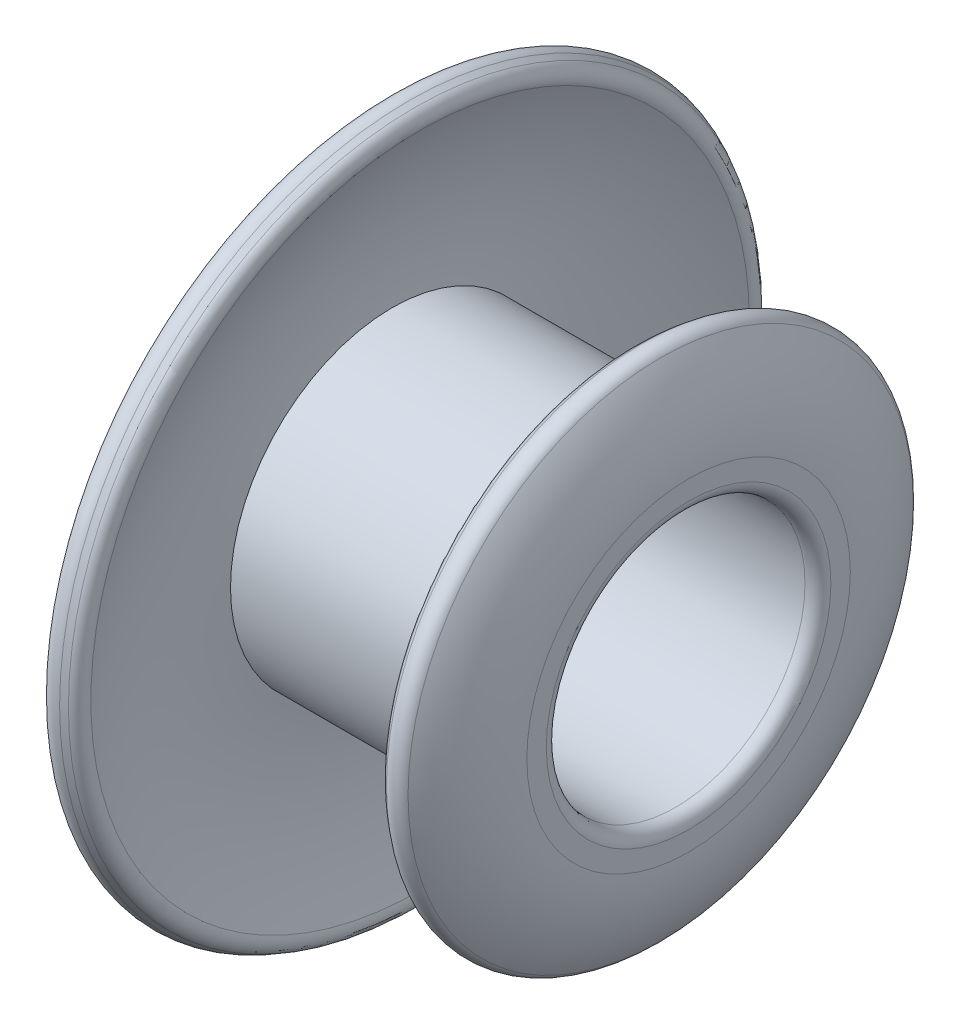
ISO-10303-21;
HEADER;
FILE_DESCRIPTION(('STEP AP214'),'2;1');
FILE_NAME('part.step','',(''),(''),'','','');
FILE_SCHEMA(('AUTOMOTIVE_DESIGN { 1 0 10303 214 1 1 1 1 }'));
ENDSEC;
DATA;
#1=APPLICATION_CONTEXT('core data for automotive mechanical design processes');
#2=APPLICATION_PROTOCOL_DEFINITION('international standard','automotive_design',2000,#1);
#3=PRODUCT_CONTEXT('',#1,'mechanical');
#4=PRODUCT('Part','Part','',(#3));
#5=PRODUCT_RELATED_PRODUCT_CATEGORY('part','',(#4));
#6=PRODUCT_DEFINITION_FORMATION('','',#4);
#7=PRODUCT_DEFINITION_CONTEXT('part definition',#1,'design');
#8=PRODUCT_DEFINITION('design','',#6,#7);
#9=PRODUCT_DEFINITION_SHAPE('','',#8);
#10=(LENGTH_UNIT() NAMED_UNIT(*) SI_UNIT(.MILLI.,.METRE.));
#11=(NAMED_UNIT(*) PLANE_ANGLE_UNIT() SI_UNIT($,.RADIAN.));
#12=(NAMED_UNIT(*) SI_UNIT($,.STERADIAN.) SOLID_ANGLE_UNIT());
#13=UNCERTAINTY_MEASURE_WITH_UNIT(LENGTH_MEASURE(1.E-05),#10,'distance_accuracy_value','');
#14=(GEOMETRIC_REPRESENTATION_CONTEXT(3) GLOBAL_UNCERTAINTY_ASSIGNED_CONTEXT((#13)) GLOBAL_UNIT_ASSIGNED_CONTEXT((#10,
#11,#12)) REPRESENTATION_CONTEXT('',''));
#15=CARTESIAN_POINT('',(0.,0.,0.));
#16=DIRECTION('',(0.,0.,1.));
#17=DIRECTION('',(1.,0.,0.));
#18=AXIS2_PLACEMENT_3D('',#15,#16,#17);
#19=CARTESIAN_POINT('',(-1.,0.,0.));
#20=DIRECTION('',(1.,0.,0.));
#21=DIRECTION('',(0.,0.,-1.));
#22=AXIS2_PLACEMENT_3D('',#19,#20,#21);
#23=TOROIDAL_SURFACE('',#22,1.25,1.);
#24=CARTESIAN_POINT('',(-0.170578942903164,0.,0.));
#25=DIRECTION('',(-1.,0.,0.));
#26=DIRECTION('',(0.,0.,1.));
#27=AXIS2_PLACEMENT_3D('',#24,#25,#26);
#28=CIRCLE('',#27,1.80862394331461);
#29=CARTESIAN_POINT('',(-0.170578942903164,0.,1.80862394331461));
#30=VERTEX_POINT('',#29);
#31=EDGE_CURVE('E47',#30,#30,#28,.T.);
#32=ORIENTED_EDGE('',*,*,#31,.T.);
#33=EDGE_LOOP('',(#32));
#34=FACE_BOUND('',#33,.T.);
#35=CARTESIAN_POINT('',(0.,0.,0.));
#36=DIRECTION('',(1.,0.,0.));
#37=DIRECTION('',(0.,0.,-1.));
#38=AXIS2_PLACEMENT_3D('',#35,#36,#37);
#39=CIRCLE('',#38,1.25);
#40=CARTESIAN_POINT('',(0.,0.,-1.25));
#41=VERTEX_POINT('',#40);
#42=EDGE_CURVE('E76',#41,#41,#39,.T.);
#43=ORIENTED_EDGE('',*,*,#42,.T.);
#44=EDGE_LOOP('',(#43));
#45=FACE_BOUND('',#44,.T.);
#46=ADVANCED_FACE('F32',(#34,#45),#23,.F.);
#47=CARTESIAN_POINT('',(0.,0.,0.));
#48=DIRECTION('',(1.,0.,0.));
#49=DIRECTION('',(0.,0.,-1.));
#50=AXIS2_PLACEMENT_3D('',#47,#48,#49);
#51=CYLINDRICAL_SURFACE('',#50,1.25);
#52=CARTESIAN_POINT('',(-2.04063984282907,0.,0.));
#53=DIRECTION('',(1.,0.,0.));
#54=DIRECTION('',(0.,0.,-1.));
#55=AXIS2_PLACEMENT_3D('',#52,#53,#54);
#56=CIRCLE('',#55,1.25);
#57=CARTESIAN_POINT('',(-2.04063984282907,0.,-1.25));
#58=VERTEX_POINT('',#57);
#59=EDGE_CURVE('E79',#58,#58,#56,.T.);
#60=ORIENTED_EDGE('',*,*,#59,.T.);
#61=EDGE_LOOP('',(#60));
#62=FACE_BOUND('',#61,.T.);
#63=ORIENTED_EDGE('',*,*,#42,.F.);
#64=EDGE_LOOP('',(#63));
#65=FACE_BOUND('',#64,.T.);
#66=ADVANCED_FACE('F104',(#62,#65),#51,.T.);
#67=CARTESIAN_POINT('',(0.190032397181517,0.,0.));
#68=DIRECTION('',(1.,0.,0.));
#69=DIRECTION('',(0.,0.,-1.));
#70=AXIS2_PLACEMENT_3D('',#67,#68,#69);
#71=DEGENERATE_TOROIDAL_SURFACE('',#70,1.54428108611693,2.25,.T.);
#72=CARTESIAN_POINT('',(-1.82538787646011,0.,0.));
#73=DIRECTION('',(1.,0.,0.));
#74=DIRECTION('',(0.,0.,-1.));
#75=AXIS2_PLACEMENT_3D('',#72,#73,#74);
#76=CIRCLE('',#75,2.54457160421371);
#77=CARTESIAN_POINT('',(-1.82538787646011,0.,-2.54457160421371));
#78=VERTEX_POINT('',#77);
#79=EDGE_CURVE('E43',#78,#78,#76,.T.);
#80=ORIENTED_EDGE('',*,*,#79,.T.);
#81=EDGE_LOOP('',(#80));
#82=FACE_BOUND('',#81,.T.);
#83=ORIENTED_EDGE('',*,*,#59,.F.);
#84=EDGE_LOOP('',(#83));
#85=FACE_BOUND('',#84,.T.);
#86=ADVANCED_FACE('F110',(#82,#85),#71,.F.);
#87=CARTESIAN_POINT('',(-1.78099676028185,0.,0.));
#88=DIRECTION('',(-1.,0.,0.));
#89=DIRECTION('',(0.,0.,1.));
#90=AXIS2_PLACEMENT_3D('',#87,#88,#89);
#91=CONICAL_SURFACE('',#90,2.62942810861169,0.503264178510874);
#92=CARTESIAN_POINT('',(-1.86673335428885,0.,0.));
#93=DIRECTION('',(1.,0.,0.));
#94=DIRECTION('',(0.,0.,-1.));
#95=AXIS2_PLACEMENT_3D('',#92,#93,#94);
#96=CIRCLE('',#95,2.67663025646083);
#97=CARTESIAN_POINT('',(-1.86673335428885,0.,-2.67663025646083));
#98=VERTEX_POINT('',#97);
#99=EDGE_CURVE('E10',#98,#98,#96,.F.);
#100=ORIENTED_EDGE('',*,*,#99,.T.);
#101=EDGE_LOOP('',(#100));
#102=FACE_BOUND('',#101,.T.);
#103=CARTESIAN_POINT('',(-1.91057288431433,0.,0.));
#104=DIRECTION('',(-1.,0.,0.));
#105=DIRECTION('',(0.,0.,1.));
#106=AXIS2_PLACEMENT_3D('',#103,#104,#105);
#107=CIRCLE('',#106,2.70076604120789);
#108=CARTESIAN_POINT('',(-1.91057288431433,0.,2.70076604120789));
#109=VERTEX_POINT('',#108);
#110=EDGE_CURVE('E39',#109,#109,#107,.F.);
#111=ORIENTED_EDGE('',*,*,#110,.T.);
#112=EDGE_LOOP('',(#111));
#113=FACE_BOUND('',#112,.T.);
#114=ADVANCED_FACE('F142',(#102,#113),#91,.T.);
#115=CARTESIAN_POINT('',(0.190032397181517,0.,0.));
#116=DIRECTION('',(1.,0.,0.));
#117=DIRECTION('',(0.,0.,-1.));
#118=AXIS2_PLACEMENT_3D('',#115,#116,#117);
#119=DEGENERATE_TOROIDAL_SURFACE('',#118,1.54428108611693,2.5,.T.);
#120=CARTESIAN_POINT('',(-2.26675876734259,0.,0.));
#121=DIRECTION('',(1.,0.,0.));
#122=DIRECTION('',(0.,0.,-1.));
#123=AXIS2_PLACEMENT_3D('',#120,#121,#122);
#124=CIRCLE('',#123,1.08148828807846);
#125=CARTESIAN_POINT('',(-2.26675876734259,0.,-1.08148828807846));
#126=VERTEX_POINT('',#125);
#127=EDGE_CURVE('E70',#126,#126,#124,.T.);
#128=ORIENTED_EDGE('',*,*,#127,.T.);
#129=EDGE_LOOP('',(#128));
#130=FACE_BOUND('',#129,.T.);
#131=CARTESIAN_POINT('',(-2.04833639245512,0.,0.));
#132=DIRECTION('',(1.,0.,0.));
#133=DIRECTION('',(0.,0.,-1.));
#134=AXIS2_PLACEMENT_3D('',#131,#132,#133);
#135=CIRCLE('',#134,2.65770156445412);
#136=CARTESIAN_POINT('',(-2.04833639245512,0.,-2.65770156445412));
#137=VERTEX_POINT('',#136);
#138=EDGE_CURVE('E73',#137,#137,#135,.F.);
#139=ORIENTED_EDGE('',*,*,#138,.T.);
#140=EDGE_LOOP('',(#139));
#141=FACE_BOUND('',#140,.T.);
#142=ADVANCED_FACE('F149',(#130,#141),#119,.T.);
#143=CARTESIAN_POINT('',(0.,0.,0.));
#144=DIRECTION('',(1.,0.,0.));
#145=DIRECTION('',(0.,0.,-1.));
#146=AXIS2_PLACEMENT_3D('',#143,#144,#145);
#147=CYLINDRICAL_SURFACE('',#146,1.);
#148=CARTESIAN_POINT('',(-2.16848712076163,0.,0.));
#149=DIRECTION('',(-1.,0.,0.));
#150=DIRECTION('',(0.,0.,1.));
#151=AXIS2_PLACEMENT_3D('',#148,#149,#150);
#152=CIRCLE('',#151,1.);
#153=CARTESIAN_POINT('',(-2.16848712076163,0.,1.));
#154=VERTEX_POINT('',#153);
#155=EDGE_CURVE('E64',#154,#154,#152,.T.);
#156=ORIENTED_EDGE('',*,*,#155,.T.);
#157=EDGE_LOOP('',(#156));
#158=FACE_BOUND('',#157,.T.);
#159=CARTESIAN_POINT('',(0.15,0.,0.));
#160=DIRECTION('',(1.,0.,0.));
#161=DIRECTION('',(0.,0.,-1.));
#162=AXIS2_PLACEMENT_3D('',#159,#160,#161);
#163=CIRCLE('',#162,1.);
#164=CARTESIAN_POINT('',(0.15,0.,-1.));
#165=VERTEX_POINT('',#164);
#166=EDGE_CURVE('E67',#165,#165,#163,.T.);
#167=ORIENTED_EDGE('',*,*,#166,.T.);
#168=EDGE_LOOP('',(#167));
#169=FACE_BOUND('',#168,.T.);
#170=ADVANCED_FACE('F100',(#158,#169),#147,.F.);
#171=CARTESIAN_POINT('',(0.25,0.,0.));
#172=DIRECTION('',(1.,0.,0.));
#173=DIRECTION('',(0.,0.,-1.));
#174=AXIS2_PLACEMENT_3D('',#171,#172,#173);
#175=PLANE('',#174);
#176=CARTESIAN_POINT('',(0.25,0.,0.));
#177=DIRECTION('',(1.,0.,0.));
#178=DIRECTION('',(0.,0.,-1.));
#179=AXIS2_PLACEMENT_3D('',#176,#177,#178);
#180=CIRCLE('',#179,1.1);
#181=CARTESIAN_POINT('',(0.25,0.,-1.1));
#182=VERTEX_POINT('',#181);
#183=EDGE_CURVE('E61',#182,#182,#180,.F.);
#184=ORIENTED_EDGE('',*,*,#183,.T.);
#185=EDGE_LOOP('',(#184));
#186=FACE_BOUND('',#185,.T.);
#187=CARTESIAN_POINT('',(0.25,0.,0.));
#188=DIRECTION('',(1.,0.,0.));
#189=DIRECTION('',(0.,0.,-1.));
#190=AXIS2_PLACEMENT_3D('',#187,#188,#189);
#191=CIRCLE('',#190,1.25);
#192=CARTESIAN_POINT('',(0.25,0.,-1.25));
#193=VERTEX_POINT('',#192);
#194=EDGE_CURVE('E82',#193,#193,#191,.T.);
#195=ORIENTED_EDGE('',*,*,#194,.T.);
#196=EDGE_LOOP('',(#195));
#197=FACE_BOUND('',#196,.T.);
#198=ADVANCED_FACE('F86',(#186,#197),#175,.T.);
#199=CARTESIAN_POINT('',(-1.,0.,0.));
#200=DIRECTION('',(1.,0.,0.));
#201=DIRECTION('',(0.,0.,-1.));
#202=AXIS2_PLACEMENT_3D('',#199,#200,#201);
#203=DEGENERATE_TOROIDAL_SURFACE('',#202,1.25,1.25,.T.);
#204=CARTESIAN_POINT('',(0.0339971841705924,0.,0.));
#205=DIRECTION('',(-1.,0.,0.));
#206=DIRECTION('',(0.,0.,1.));
#207=AXIS2_PLACEMENT_3D('',#204,#205,#206);
#208=CIRCLE('',#207,1.95238865532359);
#209=CARTESIAN_POINT('',(0.0339971841705924,0.,1.95238865532359));
#210=VERTEX_POINT('',#209);
#211=EDGE_CURVE('E58',#210,#210,#208,.F.);
#212=ORIENTED_EDGE('',*,*,#211,.T.);
#213=EDGE_LOOP('',(#212));
#214=FACE_BOUND('',#213,.T.);
#215=ORIENTED_EDGE('',*,*,#194,.F.);
#216=EDGE_LOOP('',(#215));
#217=FACE_BOUND('',#216,.T.);
#218=ADVANCED_FACE('F88',(#214,#217),#203,.T.);
#219=CARTESIAN_POINT('',(-0.0309967602818485,0.,0.));
#220=DIRECTION('',(1.,0.,0.));
#221=DIRECTION('',(0.,0.,-1.));
#222=AXIS2_PLACEMENT_3D('',#219,#220,#221);
#223=CONICAL_SURFACE('',#222,2.03964088129714,0.683760592480568);
#224=CARTESIAN_POINT('',(-0.111893861066826,0.,0.));
#225=DIRECTION('',(-1.,0.,0.));
#226=DIRECTION('',(0.,0.,1.));
#227=AXIS2_PLACEMENT_3D('',#224,#225,#226);
#228=CIRCLE('',#227,1.97371782207516);
#229=CARTESIAN_POINT('',(-0.111893861066826,0.,1.97371782207516));
#230=VERTEX_POINT('',#229);
#231=EDGE_CURVE('E52',#230,#230,#228,.T.);
#232=ORIENTED_EDGE('',*,*,#231,.T.);
#233=EDGE_LOOP('',(#232));
#234=FACE_BOUND('',#233,.T.);
#235=CARTESIAN_POINT('',(-0.150808107697252,0.,0.));
#236=DIRECTION('',(1.,0.,0.));
#237=DIRECTION('',(0.,0.,-1.));
#238=AXIS2_PLACEMENT_3D('',#235,#236,#237);
#239=CIRCLE('',#238,1.94200659682353);
#240=CARTESIAN_POINT('',(-0.150808107697252,0.,-1.94200659682353));
#241=VERTEX_POINT('',#240);
#242=EDGE_CURVE('E55',#241,#241,#239,.T.);
#243=ORIENTED_EDGE('',*,*,#242,.T.);
#244=EDGE_LOOP('',(#243));
#245=FACE_BOUND('',#244,.T.);
#246=ADVANCED_FACE('F90',(#234,#245),#223,.T.);
#247=CARTESIAN_POINT('',(-2.16848712076163,0.,0.));
#248=DIRECTION('',(-1.,0.,0.));
#249=DIRECTION('',(0.,0.,1.));
#250=AXIS2_PLACEMENT_3D('',#247,#248,#249);
#251=TOROIDAL_SURFACE('',#250,1.1,0.1);
#252=ORIENTED_EDGE('',*,*,#155,.F.);
#253=EDGE_LOOP('',(#252));
#254=FACE_BOUND('',#253,.T.);
#255=ORIENTED_EDGE('',*,*,#127,.F.);
#256=EDGE_LOOP('',(#255));
#257=FACE_BOUND('',#256,.T.);
#258=ADVANCED_FACE('F97',(#254,#257),#251,.T.);
#259=CARTESIAN_POINT('',(0.15,0.,0.));
#260=DIRECTION('',(1.,0.,0.));
#261=DIRECTION('',(0.,0.,-1.));
#262=AXIS2_PLACEMENT_3D('',#259,#260,#261);
#263=TOROIDAL_SURFACE('',#262,1.1,0.1);
#264=ORIENTED_EDGE('',*,*,#183,.F.);
#265=EDGE_LOOP('',(#264));
#266=FACE_BOUND('',#265,.T.);
#267=ORIENTED_EDGE('',*,*,#166,.F.);
#268=EDGE_LOOP('',(#267));
#269=FACE_BOUND('',#268,.T.);
#270=ADVANCED_FACE('F118',(#266,#269),#263,.T.);
#271=CARTESIAN_POINT('',(-0.0487225905630552,0.,0.));
#272=DIRECTION('',(-1.,0.,0.));
#273=DIRECTION('',(0.,0.,1.));
#274=AXIS2_PLACEMENT_3D('',#271,#272,#273);
#275=TOROIDAL_SURFACE('',#274,1.89619756289771,0.1);
#276=ORIENTED_EDGE('',*,*,#231,.F.);
#277=EDGE_LOOP('',(#276));
#278=FACE_BOUND('',#277,.T.);
#279=ORIENTED_EDGE('',*,*,#211,.F.);
#280=EDGE_LOOP('',(#279));
#281=FACE_BOUND('',#280,.T.);
#282=ADVANCED_FACE('F122',(#278,#281),#275,.T.);
#283=CARTESIAN_POINT('',(-0.0876368371934805,0.,0.));
#284=DIRECTION('',(-1.,0.,0.));
#285=DIRECTION('',(0.,0.,1.));
#286=AXIS2_PLACEMENT_3D('',#283,#284,#285);
#287=TOROIDAL_SURFACE('',#286,1.86448633764607,0.1);
#288=ORIENTED_EDGE('',*,*,#31,.F.);
#289=EDGE_LOOP('',(#288));
#290=FACE_BOUND('',#289,.T.);
#291=ORIENTED_EDGE('',*,*,#242,.F.);
#292=EDGE_LOOP('',(#291));
#293=FACE_BOUND('',#292,.T.);
#294=ADVANCED_FACE('F126',(#290,#293),#287,.T.);
#295=CARTESIAN_POINT('',(-1.91496211084418,0.,0.));
#296=DIRECTION('',(-1.,0.,0.));
#297=DIRECTION('',(0.,0.,1.));
#298=AXIS2_PLACEMENT_3D('',#295,#296,#297);
#299=TOROIDAL_SURFACE('',#298,2.58902896057357,0.1);
#300=ORIENTED_EDGE('',*,*,#99,.F.);
#301=EDGE_LOOP('',(#300));
#302=FACE_BOUND('',#301,.T.);
#303=ORIENTED_EDGE('',*,*,#79,.F.);
#304=EDGE_LOOP('',(#303));
#305=FACE_BOUND('',#304,.T.);
#306=ADVANCED_FACE('F129',(#302,#305),#299,.T.);
#307=CARTESIAN_POINT('',(-1.95880164086965,0.,0.));
#308=DIRECTION('',(-1.,0.,0.));
#309=DIRECTION('',(0.,0.,1.));
#310=AXIS2_PLACEMENT_3D('',#307,#308,#309);
#311=TOROIDAL_SURFACE('',#310,2.61316474532063,0.1);
#312=ORIENTED_EDGE('',*,*,#138,.F.);
#313=EDGE_LOOP('',(#312));
#314=FACE_BOUND('',#313,.T.);
#315=ORIENTED_EDGE('',*,*,#110,.F.);
#316=EDGE_LOOP('',(#315));
#317=FACE_BOUND('',#316,.T.);
#318=ADVANCED_FACE('F34',(#314,#317),#311,.T.);
#319=CLOSED_SHELL('',(#46,#66,#86,#114,#142,#170,#198,#218,#246,#258,#270,#282,#294,#306,#318));
#320=MANIFOLD_SOLID_BREP('B2',#319);
#321=ADVANCED_BREP_SHAPE_REPRESENTATION('',(#18,#320),#14);
#322=SHAPE_DEFINITION_REPRESENTATION(#9,#321);
ENDSEC;
END-ISO-10303-21;
